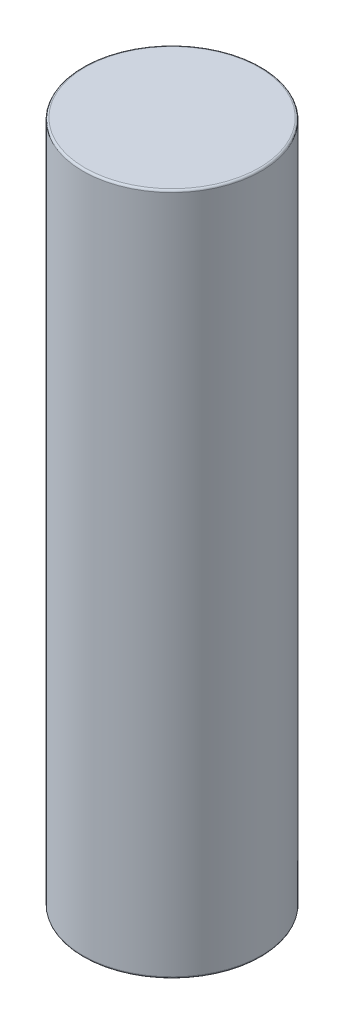
ISO-10303-21;
HEADER;
FILE_DESCRIPTION(('STEP AP214'),'2;1');
FILE_NAME('part.step','',(''),(''),'','','');
FILE_SCHEMA(('AUTOMOTIVE_DESIGN { 1 0 10303 214 1 1 1 1 }'));
ENDSEC;
DATA;
#1=APPLICATION_CONTEXT('core data for automotive mechanical design processes');
#2=APPLICATION_PROTOCOL_DEFINITION('international standard','automotive_design',2000,#1);
#3=PRODUCT_CONTEXT('',#1,'mechanical');
#4=PRODUCT('Part','Part','',(#3));
#5=PRODUCT_RELATED_PRODUCT_CATEGORY('part','',(#4));
#6=PRODUCT_DEFINITION_FORMATION('','',#4);
#7=PRODUCT_DEFINITION_CONTEXT('part definition',#1,'design');
#8=PRODUCT_DEFINITION('design','',#6,#7);
#9=PRODUCT_DEFINITION_SHAPE('','',#8);
#10=(LENGTH_UNIT() NAMED_UNIT(*) SI_UNIT(.MILLI.,.METRE.));
#11=(NAMED_UNIT(*) PLANE_ANGLE_UNIT() SI_UNIT($,.RADIAN.));
#12=(NAMED_UNIT(*) SI_UNIT($,.STERADIAN.) SOLID_ANGLE_UNIT());
#13=UNCERTAINTY_MEASURE_WITH_UNIT(LENGTH_MEASURE(1.E-05),#10,'distance_accuracy_value','');
#14=(GEOMETRIC_REPRESENTATION_CONTEXT(3) GLOBAL_UNCERTAINTY_ASSIGNED_CONTEXT((#13)) GLOBAL_UNIT_ASSIGNED_CONTEXT((#10,
#11,#12)) REPRESENTATION_CONTEXT('',''));
#15=CARTESIAN_POINT('',(0.,0.,0.));
#16=DIRECTION('',(0.,0.,1.));
#17=DIRECTION('',(1.,0.,0.));
#18=AXIS2_PLACEMENT_3D('',#15,#16,#17);
#19=CARTESIAN_POINT('',(0.,69.,0.));
#20=DIRECTION('',(0.,-1.,0.));
#21=DIRECTION('',(0.,0.,-1.));
#22=AXIS2_PLACEMENT_3D('',#19,#20,#21);
#23=CYLINDRICAL_SURFACE('',#22,9.);
#24=CARTESIAN_POINT('',(0.,68.8,0.));
#25=DIRECTION('',(0.,1.,0.));
#26=DIRECTION('',(0.,0.,1.));
#27=AXIS2_PLACEMENT_3D('',#24,#25,#26);
#28=CIRCLE('',#27,9.);
#29=CARTESIAN_POINT('',(0.,68.8,9.));
#30=VERTEX_POINT('',#29);
#31=EDGE_CURVE('E38',#30,#30,#28,.F.);
#32=ORIENTED_EDGE('',*,*,#31,.T.);
#33=EDGE_LOOP('',(#32));
#34=FACE_BOUND('',#33,.T.);
#35=CARTESIAN_POINT('',(0.,0.200000000000006,0.));
#36=DIRECTION('',(0.,1.,0.));
#37=DIRECTION('',(0.,0.,1.));
#38=AXIS2_PLACEMENT_3D('',#35,#36,#37);
#39=CIRCLE('',#38,9.);
#40=CARTESIAN_POINT('',(0.,0.200000000000006,9.));
#41=VERTEX_POINT('',#40);
#42=EDGE_CURVE('E42',#41,#41,#39,.T.);
#43=ORIENTED_EDGE('',*,*,#42,.T.);
#44=EDGE_LOOP('',(#43));
#45=FACE_BOUND('',#44,.T.);
#46=ADVANCED_FACE('F31',(#34,#45),#23,.T.);
#47=CARTESIAN_POINT('',(0.,69.,0.));
#48=DIRECTION('',(0.,1.,0.));
#49=DIRECTION('',(0.,0.,1.));
#50=AXIS2_PLACEMENT_3D('',#47,#48,#49);
#51=PLANE('',#50);
#52=CARTESIAN_POINT('',(0.,69.,0.));
#53=DIRECTION('',(0.,1.,0.));
#54=DIRECTION('',(0.,0.,1.));
#55=AXIS2_PLACEMENT_3D('',#52,#53,#54);
#56=CIRCLE('',#55,8.8);
#57=CARTESIAN_POINT('',(0.,69.,8.8));
#58=VERTEX_POINT('',#57);
#59=EDGE_CURVE('E46',#58,#58,#56,.T.);
#60=ORIENTED_EDGE('',*,*,#59,.T.);
#61=EDGE_LOOP('',(#60));
#62=FACE_BOUND('',#61,.T.);
#63=ADVANCED_FACE('F52',(#62),#51,.T.);
#64=CARTESIAN_POINT('',(0.,0.,0.));
#65=DIRECTION('',(0.,1.,0.));
#66=DIRECTION('',(0.,0.,1.));
#67=AXIS2_PLACEMENT_3D('',#64,#65,#66);
#68=PLANE('',#67);
#69=CARTESIAN_POINT('',(0.,0.,0.));
#70=DIRECTION('',(0.,1.,0.));
#71=DIRECTION('',(0.,0.,1.));
#72=AXIS2_PLACEMENT_3D('',#69,#70,#71);
#73=CIRCLE('',#72,8.8);
#74=CARTESIAN_POINT('',(0.,0.,8.8));
#75=VERTEX_POINT('',#74);
#76=EDGE_CURVE('E10',#75,#75,#73,.F.);
#77=ORIENTED_EDGE('',*,*,#76,.T.);
#78=EDGE_LOOP('',(#77));
#79=FACE_BOUND('',#78,.T.);
#80=ADVANCED_FACE('F56',(#79),#68,.F.);
#81=CARTESIAN_POINT('',(0.,68.8,0.));
#82=DIRECTION('',(0.,1.,0.));
#83=DIRECTION('',(0.,0.,1.));
#84=AXIS2_PLACEMENT_3D('',#81,#82,#83);
#85=TOROIDAL_SURFACE('',#84,8.8,0.2);
#86=ORIENTED_EDGE('',*,*,#31,.F.);
#87=EDGE_LOOP('',(#86));
#88=FACE_BOUND('',#87,.T.);
#89=ORIENTED_EDGE('',*,*,#59,.F.);
#90=EDGE_LOOP('',(#89));
#91=FACE_BOUND('',#90,.T.);
#92=ADVANCED_FACE('F54',(#88,#91),#85,.T.);
#93=CARTESIAN_POINT('',(0.,0.200000000000006,0.));
#94=DIRECTION('',(0.,1.,0.));
#95=DIRECTION('',(0.,0.,1.));
#96=AXIS2_PLACEMENT_3D('',#93,#94,#95);
#97=TOROIDAL_SURFACE('',#96,8.8,0.2);
#98=ORIENTED_EDGE('',*,*,#76,.F.);
#99=EDGE_LOOP('',(#98));
#100=FACE_BOUND('',#99,.T.);
#101=ORIENTED_EDGE('',*,*,#42,.F.);
#102=EDGE_LOOP('',(#101));
#103=FACE_BOUND('',#102,.T.);
#104=ADVANCED_FACE('F33',(#100,#103),#97,.T.);
#105=CLOSED_SHELL('',(#46,#63,#80,#92,#104));
#106=MANIFOLD_SOLID_BREP('B2',#105);
#107=ADVANCED_BREP_SHAPE_REPRESENTATION('',(#18,#106),#14);
#108=SHAPE_DEFINITION_REPRESENTATION(#9,#107);
ENDSEC;
END-ISO-10303-21;
